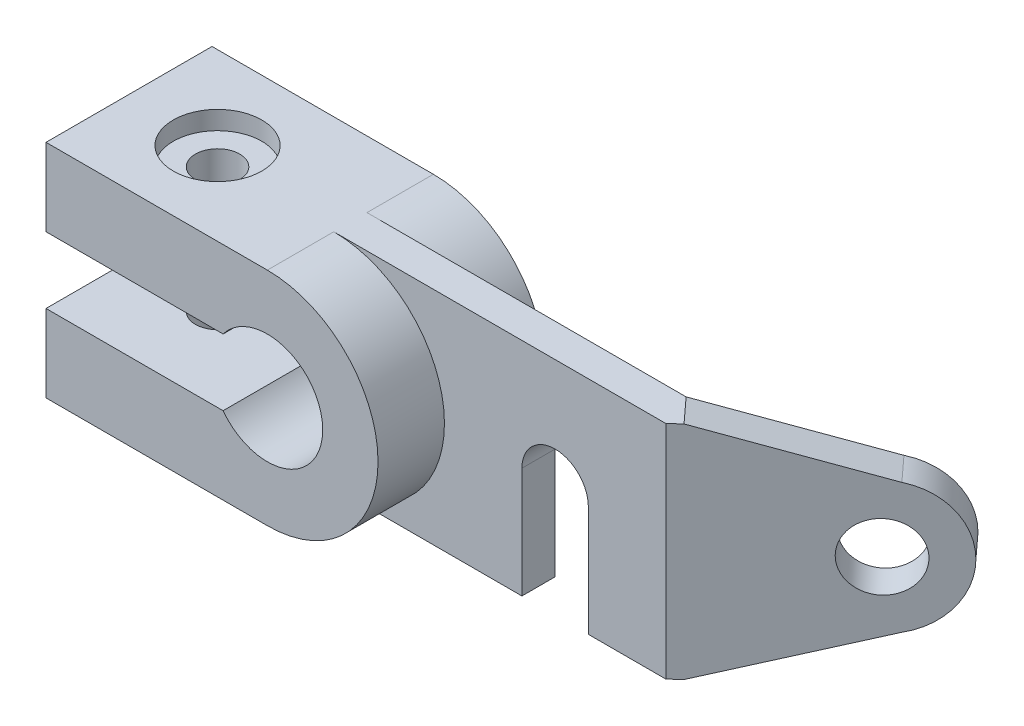
ISO-10303-21;
HEADER;
FILE_DESCRIPTION(('STEP AP214'),'2;1');
FILE_NAME('part.step','',(''),(''),'','','');
FILE_SCHEMA(('AUTOMOTIVE_DESIGN { 1 0 10303 214 1 1 1 1 }'));
ENDSEC;
DATA;
#1=APPLICATION_CONTEXT('core data for automotive mechanical design processes');
#2=APPLICATION_PROTOCOL_DEFINITION('international standard','automotive_design',2000,#1);
#3=PRODUCT_CONTEXT('',#1,'mechanical');
#4=PRODUCT('Part','Part','',(#3));
#5=PRODUCT_RELATED_PRODUCT_CATEGORY('part','',(#4));
#6=PRODUCT_DEFINITION_FORMATION('','',#4);
#7=PRODUCT_DEFINITION_CONTEXT('part definition',#1,'design');
#8=PRODUCT_DEFINITION('design','',#6,#7);
#9=PRODUCT_DEFINITION_SHAPE('','',#8);
#10=(LENGTH_UNIT() NAMED_UNIT(*) SI_UNIT(.MILLI.,.METRE.));
#11=(NAMED_UNIT(*) PLANE_ANGLE_UNIT() SI_UNIT($,.RADIAN.));
#12=(NAMED_UNIT(*) SI_UNIT($,.STERADIAN.) SOLID_ANGLE_UNIT());
#13=UNCERTAINTY_MEASURE_WITH_UNIT(LENGTH_MEASURE(1.E-05),#10,'distance_accuracy_value','');
#14=(GEOMETRIC_REPRESENTATION_CONTEXT(3) GLOBAL_UNCERTAINTY_ASSIGNED_CONTEXT((#13)) GLOBAL_UNIT_ASSIGNED_CONTEXT((#10,
#11,#12)) REPRESENTATION_CONTEXT('',''));
#15=CARTESIAN_POINT('',(0.,0.,0.));
#16=DIRECTION('',(0.,0.,1.));
#17=DIRECTION('',(1.,0.,0.));
#18=AXIS2_PLACEMENT_3D('',#15,#16,#17);
#19=CARTESIAN_POINT('',(0.,-30.,45.));
#20=DIRECTION('',(0.,1.,0.));
#21=DIRECTION('',(-1.,0.,0.));
#22=AXIS2_PLACEMENT_3D('',#19,#20,#21);
#23=PLANE('',#22);
#24=CARTESIAN_POINT('',(-36.,-30.,22.5));
#25=DIRECTION('',(0.,-1.,0.));
#26=DIRECTION('',(0.,0.,-1.));
#27=AXIS2_PLACEMENT_3D('',#24,#25,#26);
#28=CIRCLE('',#27,12.);
#29=CARTESIAN_POINT('',(-36.,-30.,10.5));
#30=VERTEX_POINT('',#29);
#31=EDGE_CURVE('E266',#30,#30,#28,.T.);
#32=ORIENTED_EDGE('',*,*,#31,.F.);
#33=EDGE_LOOP('',(#32));
#34=FACE_BOUND('',#33,.T.);
#35=DIRECTION('',(-1.,0.,0.));
#36=VECTOR('',#35,1.);
#37=CARTESIAN_POINT('',(90.,-30.,18.));
#38=LINE('',#37,#36);
#39=CARTESIAN_POINT('',(51.,-30.,18.));
#40=VERTEX_POINT('',#39);
#41=CARTESIAN_POINT('',(0.,-30.,18.));
#42=VERTEX_POINT('',#41);
#43=EDGE_CURVE('E244',#40,#42,#38,.T.);
#44=ORIENTED_EDGE('',*,*,#43,.F.);
#45=DIRECTION('',(0.,0.,-1.));
#46=VECTOR('',#45,1.);
#47=CARTESIAN_POINT('',(51.,-30.,86.));
#48=LINE('',#47,#46);
#49=CARTESIAN_POINT('',(51.,-30.,27.));
#50=VERTEX_POINT('',#49);
#51=EDGE_CURVE('E202',#50,#40,#48,.T.);
#52=ORIENTED_EDGE('',*,*,#51,.F.);
#53=DIRECTION('',(-1.,0.,0.));
#54=VECTOR('',#53,1.);
#55=CARTESIAN_POINT('',(90.,-30.,27.));
#56=LINE('',#55,#54);
#57=CARTESIAN_POINT('',(0.,-30.,27.));
#58=VERTEX_POINT('',#57);
#59=EDGE_CURVE('E257',#50,#58,#56,.T.);
#60=ORIENTED_EDGE('',*,*,#59,.T.);
#61=DIRECTION('',(0.,0.,-1.));
#62=VECTOR('',#61,1.);
#63=CARTESIAN_POINT('',(0.,-30.,45.));
#64=LINE('',#63,#62);
#65=CARTESIAN_POINT('',(0.,-30.,45.));
#66=VERTEX_POINT('',#65);
#67=EDGE_CURVE('E356',#66,#58,#64,.T.);
#68=ORIENTED_EDGE('',*,*,#67,.F.);
#69=DIRECTION('',(1.,0.,0.));
#70=VECTOR('',#69,1.);
#71=CARTESIAN_POINT('',(0.,-30.,45.));
#72=LINE('',#71,#70);
#73=CARTESIAN_POINT('',(-60.,-30.,45.));
#74=VERTEX_POINT('',#73);
#75=EDGE_CURVE('E322',#74,#66,#72,.T.);
#76=ORIENTED_EDGE('',*,*,#75,.F.);
#77=DIRECTION('',(0.,0.,-1.));
#78=VECTOR('',#77,1.);
#79=CARTESIAN_POINT('',(-60.,-30.,45.));
#80=LINE('',#79,#78);
#81=CARTESIAN_POINT('',(-60.,-30.,0.));
#82=VERTEX_POINT('',#81);
#83=EDGE_CURVE('E360',#74,#82,#80,.T.);
#84=ORIENTED_EDGE('',*,*,#83,.T.);
#85=DIRECTION('',(1.,0.,0.));
#86=VECTOR('',#85,1.);
#87=CARTESIAN_POINT('',(0.,-30.,0.));
#88=LINE('',#87,#86);
#89=CARTESIAN_POINT('',(0.,-30.,0.));
#90=VERTEX_POINT('',#89);
#91=EDGE_CURVE('E304',#82,#90,#88,.T.);
#92=ORIENTED_EDGE('',*,*,#91,.T.);
#93=EDGE_CURVE('E325',#42,#90,#64,.T.);
#94=ORIENTED_EDGE('',*,*,#93,.F.);
#95=EDGE_LOOP('',(#44,#52,#60,#68,#76,#84,#92,#94));
#96=FACE_BOUND('',#95,.T.);
#97=ADVANCED_FACE('F39',(#34,#96),#23,.F.);
#98=CARTESIAN_POINT('',(-36.,30.,22.5));
#99=DIRECTION('',(0.,1.,0.));
#100=DIRECTION('',(0.,0.,1.));
#101=AXIS2_PLACEMENT_3D('',#98,#99,#100);
#102=CYLINDRICAL_SURFACE('',#101,6.);
#103=CARTESIAN_POINT('',(-36.,-25.,22.5));
#104=DIRECTION('',(0.,-1.,0.));
#105=DIRECTION('',(0.,0.,-1.));
#106=AXIS2_PLACEMENT_3D('',#103,#104,#105);
#107=CIRCLE('',#106,6.);
#108=CARTESIAN_POINT('',(-36.,-25.,16.5));
#109=VERTEX_POINT('',#108);
#110=EDGE_CURVE('E272',#109,#109,#107,.T.);
#111=ORIENTED_EDGE('',*,*,#110,.T.);
#112=EDGE_LOOP('',(#111));
#113=FACE_BOUND('',#112,.T.);
#114=CARTESIAN_POINT('',(-36.,-9.00000000000001,22.5));
#115=DIRECTION('',(0.,-1.,0.));
#116=DIRECTION('',(1.,0.,0.));
#117=AXIS2_PLACEMENT_3D('',#114,#115,#116);
#118=CIRCLE('',#117,6.);
#119=CARTESIAN_POINT('',(-30.,-9.00000000000001,22.5));
#120=VERTEX_POINT('',#119);
#121=EDGE_CURVE('E267',#120,#120,#118,.F.);
#122=ORIENTED_EDGE('',*,*,#121,.T.);
#123=EDGE_LOOP('',(#122));
#124=FACE_BOUND('',#123,.T.);
#125=ADVANCED_FACE('F471',(#113,#124),#102,.F.);
#126=CARTESIAN_POINT('',(-60.,-30.,45.));
#127=DIRECTION('',(1.,0.,0.));
#128=DIRECTION('',(0.,0.,-1.));
#129=AXIS2_PLACEMENT_3D('',#126,#127,#128);
#130=PLANE('',#129);
#131=DIRECTION('',(0.,0.,-1.));
#132=VECTOR('',#131,1.);
#133=CARTESIAN_POINT('',(-60.,-9.00000000000001,45.));
#134=LINE('',#133,#132);
#135=CARTESIAN_POINT('',(-60.,-9.00000000000001,45.));
#136=VERTEX_POINT('',#135);
#137=CARTESIAN_POINT('',(-60.,-9.00000000000001,0.));
#138=VERTEX_POINT('',#137);
#139=EDGE_CURVE('E363',#136,#138,#134,.T.);
#140=ORIENTED_EDGE('',*,*,#139,.T.);
#141=DIRECTION('',(0.,-1.,0.));
#142=VECTOR('',#141,1.);
#143=CARTESIAN_POINT('',(-60.,-30.,0.));
#144=LINE('',#143,#142);
#145=EDGE_CURVE('E349',#138,#82,#144,.T.);
#146=ORIENTED_EDGE('',*,*,#145,.T.);
#147=ORIENTED_EDGE('',*,*,#83,.F.);
#148=DIRECTION('',(0.,-1.,0.));
#149=VECTOR('',#148,1.);
#150=CARTESIAN_POINT('',(-60.,-30.,45.));
#151=LINE('',#150,#149);
#152=EDGE_CURVE('E319',#136,#74,#151,.T.);
#153=ORIENTED_EDGE('',*,*,#152,.F.);
#154=EDGE_LOOP('',(#140,#146,#147,#153));
#155=FACE_BOUND('',#154,.T.);
#156=ADVANCED_FACE('F449',(#155),#130,.F.);
#157=CARTESIAN_POINT('',(-36.,25.,22.5));
#158=DIRECTION('',(0.,1.,0.));
#159=DIRECTION('',(0.,0.,1.));
#160=AXIS2_PLACEMENT_3D('',#157,#158,#159);
#161=CIRCLE('',#160,6.);
#162=CARTESIAN_POINT('',(-36.,25.,28.5));
#163=VERTEX_POINT('',#162);
#164=EDGE_CURVE('E290',#163,#163,#161,.T.);
#165=ORIENTED_EDGE('',*,*,#164,.T.);
#166=EDGE_LOOP('',(#165));
#167=FACE_BOUND('',#166,.T.);
#168=CARTESIAN_POINT('',(-36.,8.99999999999999,22.5));
#169=DIRECTION('',(0.,1.,0.));
#170=DIRECTION('',(0.,0.,1.));
#171=AXIS2_PLACEMENT_3D('',#168,#169,#170);
#172=CIRCLE('',#171,5.99999999999999);
#173=CARTESIAN_POINT('',(-36.,8.99999999999999,28.5));
#174=VERTEX_POINT('',#173);
#175=EDGE_CURVE('E294',#174,#174,#172,.T.);
#176=ORIENTED_EDGE('',*,*,#175,.F.);
#177=EDGE_LOOP('',(#176));
#178=FACE_BOUND('',#177,.T.);
#179=ADVANCED_FACE('F467',(#167,#178),#102,.F.);
#180=CARTESIAN_POINT('',(0.,0.,45.));
#181=DIRECTION('',(0.,0.,-1.));
#182=DIRECTION('',(-1.,0.,0.));
#183=AXIS2_PLACEMENT_3D('',#180,#181,#182);
#184=CYLINDRICAL_SURFACE('',#183,30.);
#185=DIRECTION('',(0.,0.,-1.));
#186=VECTOR('',#185,1.);
#187=CARTESIAN_POINT('',(0.,30.,45.));
#188=LINE('',#187,#186);
#189=CARTESIAN_POINT('',(0.,30.,18.));
#190=VERTEX_POINT('',#189);
#191=CARTESIAN_POINT('',(0.,30.,0.));
#192=VERTEX_POINT('',#191);
#193=EDGE_CURVE('E378',#190,#192,#188,.T.);
#194=ORIENTED_EDGE('',*,*,#193,.F.);
#195=CARTESIAN_POINT('',(0.,0.,18.));
#196=DIRECTION('',(0.,0.,-1.));
#197=DIRECTION('',(0.,1.,0.));
#198=AXIS2_PLACEMENT_3D('',#195,#196,#197);
#199=CIRCLE('',#198,30.);
#200=EDGE_CURVE('E262',#190,#42,#199,.T.);
#201=ORIENTED_EDGE('',*,*,#200,.T.);
#202=ORIENTED_EDGE('',*,*,#93,.T.);
#203=CARTESIAN_POINT('',(0.,0.,0.));
#204=DIRECTION('',(0.,0.,1.));
#205=DIRECTION('',(1.,0.,0.));
#206=AXIS2_PLACEMENT_3D('',#203,#204,#205);
#207=CIRCLE('',#206,30.);
#208=EDGE_CURVE('E298',#90,#192,#207,.T.);
#209=ORIENTED_EDGE('',*,*,#208,.T.);
#210=EDGE_LOOP('',(#194,#201,#202,#209));
#211=FACE_BOUND('',#210,.T.);
#212=ADVANCED_FACE('F422',(#211),#184,.T.);
#213=CARTESIAN_POINT('',(-60.,-9.00000000000001,45.));
#214=DIRECTION('',(0.,-1.,0.));
#215=DIRECTION('',(1.,0.,0.));
#216=AXIS2_PLACEMENT_3D('',#213,#214,#215);
#217=PLANE('',#216);
#218=ORIENTED_EDGE('',*,*,#121,.F.);
#219=EDGE_LOOP('',(#218));
#220=FACE_BOUND('',#219,.T.);
#221=DIRECTION('',(0.,0.,-1.));
#222=VECTOR('',#221,1.);
#223=CARTESIAN_POINT('',(-12.,-9.,45.));
#224=LINE('',#223,#222);
#225=CARTESIAN_POINT('',(-12.,-9.,45.));
#226=VERTEX_POINT('',#225);
#227=CARTESIAN_POINT('',(-12.,-9.,0.));
#228=VERTEX_POINT('',#227);
#229=EDGE_CURVE('E366',#226,#228,#224,.T.);
#230=ORIENTED_EDGE('',*,*,#229,.T.);
#231=DIRECTION('',(-1.,0.,0.));
#232=VECTOR('',#231,1.);
#233=CARTESIAN_POINT('',(-60.,-9.00000000000001,0.));
#234=LINE('',#233,#232);
#235=EDGE_CURVE('E345',#228,#138,#234,.T.);
#236=ORIENTED_EDGE('',*,*,#235,.T.);
#237=ORIENTED_EDGE('',*,*,#139,.F.);
#238=DIRECTION('',(-1.,0.,0.));
#239=VECTOR('',#238,1.);
#240=CARTESIAN_POINT('',(-60.,-9.00000000000001,45.));
#241=LINE('',#240,#239);
#242=EDGE_CURVE('E316',#226,#136,#241,.T.);
#243=ORIENTED_EDGE('',*,*,#242,.F.);
#244=EDGE_LOOP('',(#230,#236,#237,#243));
#245=FACE_BOUND('',#244,.T.);
#246=ADVANCED_FACE('F453',(#220,#245),#217,.F.);
#247=ORIENTED_EDGE('',*,*,#67,.T.);
#248=CARTESIAN_POINT('',(0.,0.,27.));
#249=DIRECTION('',(0.,0.,1.));
#250=DIRECTION('',(0.,-1.,0.));
#251=AXIS2_PLACEMENT_3D('',#248,#249,#250);
#252=CIRCLE('',#251,30.);
#253=CARTESIAN_POINT('',(0.,30.,27.));
#254=VERTEX_POINT('',#253);
#255=EDGE_CURVE('E248',#58,#254,#252,.T.);
#256=ORIENTED_EDGE('',*,*,#255,.T.);
#257=CARTESIAN_POINT('',(0.,30.,45.));
#258=VERTEX_POINT('',#257);
#259=EDGE_CURVE('E379',#258,#254,#188,.T.);
#260=ORIENTED_EDGE('',*,*,#259,.F.);
#261=CARTESIAN_POINT('',(0.,0.,45.));
#262=DIRECTION('',(0.,0.,1.));
#263=DIRECTION('',(1.,0.,0.));
#264=AXIS2_PLACEMENT_3D('',#261,#262,#263);
#265=CIRCLE('',#264,30.);
#266=EDGE_CURVE('E299',#66,#258,#265,.T.);
#267=ORIENTED_EDGE('',*,*,#266,.F.);
#268=EDGE_LOOP('',(#247,#256,#260,#267));
#269=FACE_BOUND('',#268,.T.);
#270=ADVANCED_FACE('F41',(#269),#184,.T.);
#271=CARTESIAN_POINT('',(0.,30.,45.));
#272=DIRECTION('',(0.,-1.,0.));
#273=DIRECTION('',(1.,0.,0.));
#274=AXIS2_PLACEMENT_3D('',#271,#272,#273);
#275=PLANE('',#274);
#276=CARTESIAN_POINT('',(-36.,30.,22.5));
#277=DIRECTION('',(0.,1.,0.));
#278=DIRECTION('',(0.,0.,1.));
#279=AXIS2_PLACEMENT_3D('',#276,#277,#278);
#280=CIRCLE('',#279,12.);
#281=CARTESIAN_POINT('',(-36.,30.,34.5));
#282=VERTEX_POINT('',#281);
#283=EDGE_CURVE('E271',#282,#282,#280,.T.);
#284=ORIENTED_EDGE('',*,*,#283,.F.);
#285=EDGE_LOOP('',(#284));
#286=FACE_BOUND('',#285,.T.);
#287=DIRECTION('',(0.737801146634762,0.,-0.675018124219217));
#288=VECTOR('',#287,1.);
#289=CARTESIAN_POINT('',(90.,30.,27.));
#290=LINE('',#289,#288);
#291=CARTESIAN_POINT('',(90.,30.,27.));
#292=VERTEX_POINT('',#291);
#293=CARTESIAN_POINT('',(92.5792722735358,30.,24.6402103197128));
#294=VERTEX_POINT('',#293);
#295=EDGE_CURVE('E226',#292,#294,#290,.T.);
#296=ORIENTED_EDGE('',*,*,#295,.T.);
#297=DIRECTION('',(-0.67501812421922,0.,-0.73780114663476));
#298=VECTOR('',#297,1.);
#299=CARTESIAN_POINT('',(132.40534160247,30.,68.1704779711637));
#300=LINE('',#299,#298);
#301=CARTESIAN_POINT('',(86.5041091555628,30.,18.));
#302=VERTEX_POINT('',#301);
#303=EDGE_CURVE('E222',#294,#302,#300,.T.);
#304=ORIENTED_EDGE('',*,*,#303,.T.);
#305=DIRECTION('',(-1.,0.,0.));
#306=VECTOR('',#305,1.);
#307=CARTESIAN_POINT('',(90.,30.,18.));
#308=LINE('',#307,#306);
#309=EDGE_CURVE('E245',#302,#190,#308,.T.);
#310=ORIENTED_EDGE('',*,*,#309,.T.);
#311=ORIENTED_EDGE('',*,*,#193,.T.);
#312=DIRECTION('',(-1.,0.,0.));
#313=VECTOR('',#312,1.);
#314=CARTESIAN_POINT('',(0.,30.,0.));
#315=LINE('',#314,#313);
#316=CARTESIAN_POINT('',(-60.,30.,0.));
#317=VERTEX_POINT('',#316);
#318=EDGE_CURVE('E329',#192,#317,#315,.T.);
#319=ORIENTED_EDGE('',*,*,#318,.T.);
#320=DIRECTION('',(0.,0.,-1.));
#321=VECTOR('',#320,1.);
#322=CARTESIAN_POINT('',(-60.,30.,45.));
#323=LINE('',#322,#321);
#324=CARTESIAN_POINT('',(-60.,30.,45.));
#325=VERTEX_POINT('',#324);
#326=EDGE_CURVE('E375',#325,#317,#323,.T.);
#327=ORIENTED_EDGE('',*,*,#326,.F.);
#328=DIRECTION('',(-1.,0.,0.));
#329=VECTOR('',#328,1.);
#330=CARTESIAN_POINT('',(0.,30.,45.));
#331=LINE('',#330,#329);
#332=EDGE_CURVE('E303',#258,#325,#331,.T.);
#333=ORIENTED_EDGE('',*,*,#332,.F.);
#334=ORIENTED_EDGE('',*,*,#259,.T.);
#335=DIRECTION('',(-1.,0.,0.));
#336=VECTOR('',#335,1.);
#337=CARTESIAN_POINT('',(90.,30.,27.));
#338=LINE('',#337,#336);
#339=EDGE_CURVE('E249',#292,#254,#338,.T.);
#340=ORIENTED_EDGE('',*,*,#339,.F.);
#341=EDGE_LOOP('',(#296,#304,#310,#311,#319,#327,#333,#334,#340));
#342=FACE_BOUND('',#341,.T.);
#343=ADVANCED_FACE('F426',(#286,#342),#275,.F.);
#344=CARTESIAN_POINT('',(-60.,8.99999999999999,45.));
#345=DIRECTION('',(0.,1.,0.));
#346=DIRECTION('',(-1.,0.,0.));
#347=AXIS2_PLACEMENT_3D('',#344,#345,#346);
#348=PLANE('',#347);
#349=DIRECTION('',(0.,0.,-1.));
#350=VECTOR('',#349,1.);
#351=CARTESIAN_POINT('',(-60.,8.99999999999999,45.));
#352=LINE('',#351,#350);
#353=CARTESIAN_POINT('',(-60.,8.99999999999999,45.));
#354=VERTEX_POINT('',#353);
#355=CARTESIAN_POINT('',(-60.,8.99999999999999,0.));
#356=VERTEX_POINT('',#355);
#357=EDGE_CURVE('E372',#354,#356,#352,.T.);
#358=ORIENTED_EDGE('',*,*,#357,.T.);
#359=DIRECTION('',(1.,0.,0.));
#360=VECTOR('',#359,1.);
#361=CARTESIAN_POINT('',(-60.,8.99999999999999,0.));
#362=LINE('',#361,#360);
#363=CARTESIAN_POINT('',(-12.,8.99999999999999,0.));
#364=VERTEX_POINT('',#363);
#365=EDGE_CURVE('E337',#356,#364,#362,.T.);
#366=ORIENTED_EDGE('',*,*,#365,.T.);
#367=DIRECTION('',(0.,0.,-1.));
#368=VECTOR('',#367,1.);
#369=CARTESIAN_POINT('',(-12.,8.99999999999999,45.));
#370=LINE('',#369,#368);
#371=CARTESIAN_POINT('',(-12.,8.99999999999999,45.));
#372=VERTEX_POINT('',#371);
#373=EDGE_CURVE('E369',#372,#364,#370,.T.);
#374=ORIENTED_EDGE('',*,*,#373,.F.);
#375=DIRECTION('',(1.,0.,0.));
#376=VECTOR('',#375,1.);
#377=CARTESIAN_POINT('',(-60.,8.99999999999999,45.));
#378=LINE('',#377,#376);
#379=EDGE_CURVE('E310',#354,#372,#378,.T.);
#380=ORIENTED_EDGE('',*,*,#379,.F.);
#381=EDGE_LOOP('',(#358,#366,#374,#380));
#382=FACE_BOUND('',#381,.T.);
#383=ORIENTED_EDGE('',*,*,#175,.T.);
#384=EDGE_LOOP('',(#383));
#385=FACE_BOUND('',#384,.T.);
#386=ADVANCED_FACE('F461',(#382,#385),#348,.F.);
#387=CARTESIAN_POINT('',(0.,0.,45.));
#388=DIRECTION('',(0.,0.,-1.));
#389=DIRECTION('',(-1.,0.,0.));
#390=AXIS2_PLACEMENT_3D('',#387,#388,#389);
#391=CYLINDRICAL_SURFACE('',#390,15.);
#392=ORIENTED_EDGE('',*,*,#373,.T.);
#393=CARTESIAN_POINT('',(0.,0.,0.));
#394=DIRECTION('',(0.,0.,-1.));
#395=DIRECTION('',(1.,0.,0.));
#396=AXIS2_PLACEMENT_3D('',#393,#394,#395);
#397=CIRCLE('',#396,15.);
#398=EDGE_CURVE('E341',#364,#228,#397,.T.);
#399=ORIENTED_EDGE('',*,*,#398,.T.);
#400=ORIENTED_EDGE('',*,*,#229,.F.);
#401=CARTESIAN_POINT('',(0.,0.,45.));
#402=DIRECTION('',(0.,0.,-1.));
#403=DIRECTION('',(1.,0.,0.));
#404=AXIS2_PLACEMENT_3D('',#401,#402,#403);
#405=CIRCLE('',#404,15.);
#406=EDGE_CURVE('E313',#372,#226,#405,.T.);
#407=ORIENTED_EDGE('',*,*,#406,.F.);
#408=EDGE_LOOP('',(#392,#399,#400,#407));
#409=FACE_BOUND('',#408,.T.);
#410=ADVANCED_FACE('F458',(#409),#391,.F.);
#411=DIRECTION('',(0.,-1.,0.));
#412=VECTOR('',#411,1.);
#413=CARTESIAN_POINT('',(-60.,8.99999999999999,0.));
#414=LINE('',#413,#412);
#415=EDGE_CURVE('E333',#317,#356,#414,.T.);
#416=ORIENTED_EDGE('',*,*,#415,.T.);
#417=ORIENTED_EDGE('',*,*,#357,.F.);
#418=DIRECTION('',(0.,-1.,0.));
#419=VECTOR('',#418,1.);
#420=CARTESIAN_POINT('',(-60.,8.99999999999999,45.));
#421=LINE('',#420,#419);
#422=EDGE_CURVE('E307',#325,#354,#421,.T.);
#423=ORIENTED_EDGE('',*,*,#422,.F.);
#424=ORIENTED_EDGE('',*,*,#326,.T.);
#425=EDGE_LOOP('',(#416,#417,#423,#424));
#426=FACE_BOUND('',#425,.T.);
#427=ADVANCED_FACE('F435',(#426),#130,.F.);
#428=CARTESIAN_POINT('',(90.,-30.,27.));
#429=VERTEX_POINT('',#428);
#430=CARTESIAN_POINT('',(69.,-30.,27.));
#431=VERTEX_POINT('',#430);
#432=EDGE_CURVE('E253',#429,#431,#56,.T.);
#433=ORIENTED_EDGE('',*,*,#432,.T.);
#434=DIRECTION('',(0.,0.,-1.));
#435=VECTOR('',#434,1.);
#436=CARTESIAN_POINT('',(69.,-30.,86.));
#437=LINE('',#436,#435);
#438=CARTESIAN_POINT('',(69.,-30.,18.));
#439=VERTEX_POINT('',#438);
#440=EDGE_CURVE('E55',#431,#439,#437,.T.);
#441=ORIENTED_EDGE('',*,*,#440,.T.);
#442=CARTESIAN_POINT('',(86.5041091555628,-30.,18.));
#443=VERTEX_POINT('',#442);
#444=EDGE_CURVE('E193',#443,#439,#38,.T.);
#445=ORIENTED_EDGE('',*,*,#444,.F.);
#446=DIRECTION('',(-0.67501812421922,0.,-0.73780114663476));
#447=VECTOR('',#446,1.);
#448=CARTESIAN_POINT('',(132.40534160247,-30.,68.1704779711637));
#449=LINE('',#448,#447);
#450=CARTESIAN_POINT('',(92.5792722735358,-30.,24.6402103197128));
#451=VERTEX_POINT('',#450);
#452=EDGE_CURVE('E221',#451,#443,#449,.T.);
#453=ORIENTED_EDGE('',*,*,#452,.F.);
#454=DIRECTION('',(-0.737801146634762,0.,0.675018124219217));
#455=VECTOR('',#454,1.);
#456=CARTESIAN_POINT('',(90.,-30.,27.));
#457=LINE('',#456,#455);
#458=EDGE_CURVE('E237',#451,#429,#457,.T.);
#459=ORIENTED_EDGE('',*,*,#458,.T.);
#460=EDGE_LOOP('',(#433,#441,#445,#453,#459));
#461=FACE_BOUND('',#460,.T.);
#462=ADVANCED_FACE('F484',(#461),#23,.F.);
#463=CARTESIAN_POINT('',(0.,0.,45.));
#464=DIRECTION('',(0.,0.,1.));
#465=DIRECTION('',(1.,0.,0.));
#466=AXIS2_PLACEMENT_3D('',#463,#464,#465);
#467=PLANE('',#466);
#468=ORIENTED_EDGE('',*,*,#266,.T.);
#469=ORIENTED_EDGE('',*,*,#332,.T.);
#470=ORIENTED_EDGE('',*,*,#422,.T.);
#471=ORIENTED_EDGE('',*,*,#379,.T.);
#472=ORIENTED_EDGE('',*,*,#406,.T.);
#473=ORIENTED_EDGE('',*,*,#242,.T.);
#474=ORIENTED_EDGE('',*,*,#152,.T.);
#475=ORIENTED_EDGE('',*,*,#75,.T.);
#476=EDGE_LOOP('',(#468,#469,#470,#471,#472,#473,#474,#475));
#477=FACE_BOUND('',#476,.T.);
#478=ADVANCED_FACE('F442',(#477),#467,.T.);
#479=CARTESIAN_POINT('',(0.,0.,0.));
#480=DIRECTION('',(0.,0.,1.));
#481=DIRECTION('',(1.,0.,0.));
#482=AXIS2_PLACEMENT_3D('',#479,#480,#481);
#483=PLANE('',#482);
#484=ORIENTED_EDGE('',*,*,#208,.F.);
#485=ORIENTED_EDGE('',*,*,#91,.F.);
#486=ORIENTED_EDGE('',*,*,#145,.F.);
#487=ORIENTED_EDGE('',*,*,#235,.F.);
#488=ORIENTED_EDGE('',*,*,#398,.F.);
#489=ORIENTED_EDGE('',*,*,#365,.F.);
#490=ORIENTED_EDGE('',*,*,#415,.F.);
#491=ORIENTED_EDGE('',*,*,#318,.F.);
#492=EDGE_LOOP('',(#484,#485,#486,#487,#488,#489,#490,#491));
#493=FACE_BOUND('',#492,.T.);
#494=ADVANCED_FACE('F430',(#493),#483,.F.);
#495=CARTESIAN_POINT('',(-30.,25.,22.5));
#496=DIRECTION('',(0.,-1.,0.));
#497=DIRECTION('',(0.,0.,-1.));
#498=AXIS2_PLACEMENT_3D('',#495,#496,#497);
#499=PLANE('',#498);
#500=ORIENTED_EDGE('',*,*,#164,.F.);
#501=EDGE_LOOP('',(#500));
#502=FACE_BOUND('',#501,.T.);
#503=CARTESIAN_POINT('',(-36.,25.,22.5));
#504=DIRECTION('',(0.,1.,0.));
#505=DIRECTION('',(0.,0.,1.));
#506=AXIS2_PLACEMENT_3D('',#503,#504,#505);
#507=CIRCLE('',#506,12.);
#508=CARTESIAN_POINT('',(-36.,25.,34.5));
#509=VERTEX_POINT('',#508);
#510=EDGE_CURVE('E286',#509,#509,#507,.T.);
#511=ORIENTED_EDGE('',*,*,#510,.T.);
#512=EDGE_LOOP('',(#511));
#513=FACE_BOUND('',#512,.T.);
#514=ADVANCED_FACE('F547',(#502,#513),#499,.F.);
#515=CARTESIAN_POINT('',(-36.,30.,22.5));
#516=DIRECTION('',(0.,1.,0.));
#517=DIRECTION('',(0.,0.,1.));
#518=AXIS2_PLACEMENT_3D('',#515,#516,#517);
#519=CYLINDRICAL_SURFACE('',#518,12.);
#520=ORIENTED_EDGE('',*,*,#510,.F.);
#521=EDGE_LOOP('',(#520));
#522=FACE_BOUND('',#521,.T.);
#523=ORIENTED_EDGE('',*,*,#283,.T.);
#524=EDGE_LOOP('',(#523));
#525=FACE_BOUND('',#524,.T.);
#526=ADVANCED_FACE('F544',(#522,#525),#519,.F.);
#527=CARTESIAN_POINT('',(-30.,-25.,22.5));
#528=DIRECTION('',(0.,1.,0.));
#529=DIRECTION('',(0.,0.,1.));
#530=AXIS2_PLACEMENT_3D('',#527,#528,#529);
#531=PLANE('',#530);
#532=CARTESIAN_POINT('',(-36.,-25.,22.5));
#533=DIRECTION('',(0.,-1.,0.));
#534=DIRECTION('',(0.,0.,-1.));
#535=AXIS2_PLACEMENT_3D('',#532,#533,#534);
#536=CIRCLE('',#535,12.);
#537=CARTESIAN_POINT('',(-36.,-25.,10.5));
#538=VERTEX_POINT('',#537);
#539=EDGE_CURVE('E276',#538,#538,#536,.T.);
#540=ORIENTED_EDGE('',*,*,#539,.T.);
#541=EDGE_LOOP('',(#540));
#542=FACE_BOUND('',#541,.T.);
#543=ORIENTED_EDGE('',*,*,#110,.F.);
#544=EDGE_LOOP('',(#543));
#545=FACE_BOUND('',#544,.T.);
#546=ADVANCED_FACE('F540',(#542,#545),#531,.F.);
#547=CARTESIAN_POINT('',(-36.,-30.,22.5));
#548=DIRECTION('',(0.,-1.,0.));
#549=DIRECTION('',(0.,0.,-1.));
#550=AXIS2_PLACEMENT_3D('',#547,#548,#549);
#551=CYLINDRICAL_SURFACE('',#550,12.);
#552=ORIENTED_EDGE('',*,*,#31,.T.);
#553=EDGE_LOOP('',(#552));
#554=FACE_BOUND('',#553,.T.);
#555=ORIENTED_EDGE('',*,*,#539,.F.);
#556=EDGE_LOOP('',(#555));
#557=FACE_BOUND('',#556,.T.);
#558=ADVANCED_FACE('F537',(#554,#557),#551,.F.);
#559=CARTESIAN_POINT('',(90.,30.,18.));
#560=DIRECTION('',(0.,0.,-1.));
#561=DIRECTION('',(0.,1.,0.));
#562=AXIS2_PLACEMENT_3D('',#559,#560,#561);
#563=PLANE('',#562);
#564=DIRECTION('',(0.,1.,0.));
#565=VECTOR('',#564,1.);
#566=CARTESIAN_POINT('',(51.,0.,18.));
#567=LINE('',#566,#565);
#568=CARTESIAN_POINT('',(51.,0.,18.));
#569=VERTEX_POINT('',#568);
#570=EDGE_CURVE('E177',#40,#569,#567,.T.);
#571=ORIENTED_EDGE('',*,*,#570,.F.);
#572=ORIENTED_EDGE('',*,*,#43,.T.);
#573=ORIENTED_EDGE('',*,*,#200,.F.);
#574=ORIENTED_EDGE('',*,*,#309,.F.);
#575=DIRECTION('',(0.,1.,0.));
#576=VECTOR('',#575,1.);
#577=CARTESIAN_POINT('',(86.5041091555628,30.,18.));
#578=LINE('',#577,#576);
#579=EDGE_CURVE('E383',#443,#302,#578,.T.);
#580=ORIENTED_EDGE('',*,*,#579,.F.);
#581=ORIENTED_EDGE('',*,*,#444,.T.);
#582=DIRECTION('',(0.,-1.,0.));
#583=VECTOR('',#582,1.);
#584=CARTESIAN_POINT('',(69.,0.,18.));
#585=LINE('',#584,#583);
#586=CARTESIAN_POINT('',(69.,0.,18.));
#587=VERTEX_POINT('',#586);
#588=EDGE_CURVE('E172',#587,#439,#585,.T.);
#589=ORIENTED_EDGE('',*,*,#588,.F.);
#590=CARTESIAN_POINT('',(60.,0.,18.));
#591=DIRECTION('',(0.,0.,-1.));
#592=DIRECTION('',(0.,1.,0.));
#593=AXIS2_PLACEMENT_3D('',#590,#591,#592);
#594=CIRCLE('',#593,9.00000000000001);
#595=EDGE_CURVE('E180',#569,#587,#594,.T.);
#596=ORIENTED_EDGE('',*,*,#595,.F.);
#597=EDGE_LOOP('',(#571,#572,#573,#574,#580,#581,#589,#596));
#598=FACE_BOUND('',#597,.T.);
#599=ADVANCED_FACE('F190',(#598),#563,.T.);
#600=CARTESIAN_POINT('',(90.,30.,27.));
#601=DIRECTION('',(0.,0.,1.));
#602=DIRECTION('',(0.,-1.,0.));
#603=AXIS2_PLACEMENT_3D('',#600,#601,#602);
#604=PLANE('',#603);
#605=DIRECTION('',(0.,-1.,0.));
#606=VECTOR('',#605,1.);
#607=CARTESIAN_POINT('',(51.,30.,27.));
#608=LINE('',#607,#606);
#609=CARTESIAN_POINT('',(51.,0.,27.));
#610=VERTEX_POINT('',#609);
#611=EDGE_CURVE('E11',#610,#50,#608,.T.);
#612=ORIENTED_EDGE('',*,*,#611,.F.);
#613=CARTESIAN_POINT('',(60.,0.,27.));
#614=DIRECTION('',(0.,0.,1.));
#615=DIRECTION('',(0.,-1.,0.));
#616=AXIS2_PLACEMENT_3D('',#613,#614,#615);
#617=CIRCLE('',#616,9.00000000000001);
#618=CARTESIAN_POINT('',(69.,0.,27.));
#619=VERTEX_POINT('',#618);
#620=EDGE_CURVE('E48',#619,#610,#617,.T.);
#621=ORIENTED_EDGE('',*,*,#620,.F.);
#622=DIRECTION('',(0.,1.,0.));
#623=VECTOR('',#622,1.);
#624=CARTESIAN_POINT('',(69.,30.,27.));
#625=LINE('',#624,#623);
#626=EDGE_CURVE('E173',#431,#619,#625,.T.);
#627=ORIENTED_EDGE('',*,*,#626,.F.);
#628=ORIENTED_EDGE('',*,*,#432,.F.);
#629=DIRECTION('',(0.,1.,0.));
#630=VECTOR('',#629,1.);
#631=CARTESIAN_POINT('',(90.,30.,27.));
#632=LINE('',#631,#630);
#633=EDGE_CURVE('E240',#429,#292,#632,.T.);
#634=ORIENTED_EDGE('',*,*,#633,.T.);
#635=ORIENTED_EDGE('',*,*,#339,.T.);
#636=ORIENTED_EDGE('',*,*,#255,.F.);
#637=ORIENTED_EDGE('',*,*,#59,.F.);
#638=EDGE_LOOP('',(#612,#621,#627,#628,#634,#635,#636,#637));
#639=FACE_BOUND('',#638,.T.);
#640=ADVANCED_FACE('F407',(#639),#604,.T.);
#641=CARTESIAN_POINT('',(83.9248368820271,-99.4691116978831,20.3597896802871));
#642=DIRECTION('',(-0.67501812421922,0.,-0.73780114663476));
#643=DIRECTION('',(-0.73780114663476,0.,0.67501812421922));
#644=AXIS2_PLACEMENT_3D('',#641,#642,#643);
#645=PLANE('',#644);
#646=CARTESIAN_POINT('',(114.540552727684,0.,-7.65068872033035));
#647=DIRECTION('',(-0.67501812421922,0.,-0.73780114663476));
#648=DIRECTION('',(-0.73780114663476,0.,0.67501812421922));
#649=AXIS2_PLACEMENT_3D('',#646,#647,#648);
#650=CIRCLE('',#649,8.99999999999999);
#651=CARTESIAN_POINT('',(107.900342407971,0.,-1.57552560235737));
#652=VERTEX_POINT('',#651);
#653=EDGE_CURVE('E201',#652,#652,#650,.T.);
#654=ORIENTED_EDGE('',*,*,#653,.F.);
#655=EDGE_LOOP('',(#654));
#656=FACE_BOUND('',#655,.T.);
#657=DIRECTION('',(-0.707306646784677,0.284525734488815,0.647118546966332));
#658=VECTOR('',#657,1.);
#659=CARTESIAN_POINT('',(86.5041091555628,30.,18.));
#660=LINE('',#659,#658);
#661=CARTESIAN_POINT('',(117.341917443499,17.5949843069673,-10.2136719365378));
#662=VERTEX_POINT('',#661);
#663=EDGE_CURVE('E218',#662,#302,#660,.T.);
#664=ORIENTED_EDGE('',*,*,#663,.F.);
#665=CARTESIAN_POINT('',(114.540552727684,0.,-7.65068872033033));
#666=DIRECTION('',(0.67501812421922,0.,0.73780114663476));
#667=DIRECTION('',(-0.73780114663476,0.,0.67501812421922));
#668=AXIS2_PLACEMENT_3D('',#665,#666,#667);
#669=CIRCLE('',#668,18.);
#670=CARTESIAN_POINT('',(117.341917443499,-17.5949843069673,-10.2136719365378));
#671=VERTEX_POINT('',#670);
#672=EDGE_CURVE('E214',#671,#662,#669,.T.);
#673=ORIENTED_EDGE('',*,*,#672,.F.);
#674=DIRECTION('',(0.707306646784677,0.284525734488815,-0.647118546966332));
#675=VECTOR('',#674,1.);
#676=CARTESIAN_POINT('',(86.5041091555628,-30.,18.));
#677=LINE('',#676,#675);
#678=EDGE_CURVE('E211',#443,#671,#677,.T.);
#679=ORIENTED_EDGE('',*,*,#678,.F.);
#680=ORIENTED_EDGE('',*,*,#579,.T.);
#681=EDGE_LOOP('',(#664,#673,#679,#680));
#682=FACE_BOUND('',#681,.T.);
#683=ADVANCED_FACE('F508',(#656,#682),#645,.T.);
#684=CARTESIAN_POINT('',(90.,-99.4691116978831,27.));
#685=DIRECTION('',(0.675018124219217,0.,0.737801146634762));
#686=DIRECTION('',(0.737801146634762,0.,-0.675018124219217));
#687=AXIS2_PLACEMENT_3D('',#684,#685,#686);
#688=PLANE('',#687);
#689=CARTESIAN_POINT('',(120.615715845657,0.,-1.01047840061742));
#690=DIRECTION('',(0.675018124219217,0.,0.737801146634762));
#691=DIRECTION('',(0.737801146634762,0.,-0.675018124219217));
#692=AXIS2_PLACEMENT_3D('',#689,#690,#691);
#693=CIRCLE('',#692,8.99999999999999);
#694=CARTESIAN_POINT('',(127.25592616537,0.,-7.08564151859037));
#695=VERTEX_POINT('',#694);
#696=EDGE_CURVE('E210',#695,#695,#693,.T.);
#697=ORIENTED_EDGE('',*,*,#696,.F.);
#698=EDGE_LOOP('',(#697));
#699=FACE_BOUND('',#698,.T.);
#700=DIRECTION('',(0.70730664678468,-0.284525734488815,-0.647118546966329));
#701=VECTOR('',#700,1.);
#702=CARTESIAN_POINT('',(116.264067678541,20.4724014125123,2.97086724573568));
#703=LINE('',#702,#701);
#704=CARTESIAN_POINT('',(123.417080561472,17.5949843069673,-3.57346161682482));
#705=VERTEX_POINT('',#704);
#706=EDGE_CURVE('E393',#294,#705,#703,.T.);
#707=ORIENTED_EDGE('',*,*,#706,.F.);
#708=ORIENTED_EDGE('',*,*,#295,.F.);
#709=ORIENTED_EDGE('',*,*,#633,.F.);
#710=ORIENTED_EDGE('',*,*,#458,.F.);
#711=DIRECTION('',(-0.70730664678468,-0.284525734488815,0.647118546966329));
#712=VECTOR('',#711,1.);
#713=CARTESIAN_POINT('',(76.2283583374421,-36.577424117784,39.5997469167407));
#714=LINE('',#713,#712);
#715=CARTESIAN_POINT('',(123.417080561472,-17.5949843069673,-3.57346161682483));
#716=VERTEX_POINT('',#715);
#717=EDGE_CURVE('E387',#716,#451,#714,.T.);
#718=ORIENTED_EDGE('',*,*,#717,.F.);
#719=CARTESIAN_POINT('',(120.615715845657,0.,-1.0104784006174));
#720=DIRECTION('',(0.675018124219217,0.,0.737801146634762));
#721=DIRECTION('',(0.737801146634762,0.,-0.675018124219217));
#722=AXIS2_PLACEMENT_3D('',#719,#720,#721);
#723=CIRCLE('',#722,18.);
#724=EDGE_CURVE('E390',#705,#716,#723,.F.);
#725=ORIENTED_EDGE('',*,*,#724,.F.);
#726=EDGE_LOOP('',(#707,#708,#709,#710,#718,#725));
#727=FACE_BOUND('',#726,.T.);
#728=ADVANCED_FACE('F501',(#699,#727),#688,.T.);
#729=CARTESIAN_POINT('',(132.40534160247,30.,68.1704779711637));
#730=DIRECTION('',(-0.209923413152945,-0.958668402740802,0.192060027586736));
#731=DIRECTION('',(0.976854323947292,-0.213905656272758,0.));
#732=AXIS2_PLACEMENT_3D('',#729,#730,#731);
#733=PLANE('',#732);
#734=ORIENTED_EDGE('',*,*,#706,.T.);
#735=DIRECTION('',(-0.67501812421922,0.,-0.73780114663476));
#736=VECTOR('',#735,1.);
#737=CARTESIAN_POINT('',(163.243149890406,17.5949843069673,39.9568060346259));
#738=LINE('',#737,#736);
#739=EDGE_CURVE('E227',#705,#662,#738,.T.);
#740=ORIENTED_EDGE('',*,*,#739,.T.);
#741=ORIENTED_EDGE('',*,*,#663,.T.);
#742=ORIENTED_EDGE('',*,*,#303,.F.);
#743=EDGE_LOOP('',(#734,#740,#741,#742));
#744=FACE_BOUND('',#743,.T.);
#745=ADVANCED_FACE('F514',(#744),#733,.F.);
#746=CARTESIAN_POINT('',(160.441785174591,0.,42.5197892508333));
#747=DIRECTION('',(-0.67501812421922,0.,-0.73780114663476));
#748=DIRECTION('',(-0.73780114663476,0.,0.67501812421922));
#749=AXIS2_PLACEMENT_3D('',#746,#747,#748);
#750=CYLINDRICAL_SURFACE('',#749,18.);
#751=ORIENTED_EDGE('',*,*,#724,.T.);
#752=DIRECTION('',(-0.67501812421922,0.,-0.73780114663476));
#753=VECTOR('',#752,1.);
#754=CARTESIAN_POINT('',(163.243149890406,-17.5949843069673,39.9568060346259));
#755=LINE('',#754,#753);
#756=EDGE_CURVE('E63',#716,#671,#755,.T.);
#757=ORIENTED_EDGE('',*,*,#756,.T.);
#758=ORIENTED_EDGE('',*,*,#672,.T.);
#759=ORIENTED_EDGE('',*,*,#739,.F.);
#760=EDGE_LOOP('',(#751,#757,#758,#759));
#761=FACE_BOUND('',#760,.T.);
#762=ADVANCED_FACE('F513',(#761),#750,.T.);
#763=CARTESIAN_POINT('',(132.40534160247,-30.,68.1704779711637));
#764=DIRECTION('',(-0.209923413152945,0.958668402740802,0.192060027586736));
#765=DIRECTION('',(-0.976854323947292,-0.213905656272758,0.));
#766=AXIS2_PLACEMENT_3D('',#763,#764,#765);
#767=PLANE('',#766);
#768=ORIENTED_EDGE('',*,*,#717,.T.);
#769=ORIENTED_EDGE('',*,*,#452,.T.);
#770=ORIENTED_EDGE('',*,*,#678,.T.);
#771=ORIENTED_EDGE('',*,*,#756,.F.);
#772=EDGE_LOOP('',(#768,#769,#770,#771));
#773=FACE_BOUND('',#772,.T.);
#774=ADVANCED_FACE('F510',(#773),#767,.F.);
#775=CARTESIAN_POINT('',(160.441785174591,0.,42.5197892508333));
#776=DIRECTION('',(-0.67501812421922,0.,-0.73780114663476));
#777=DIRECTION('',(-0.73780114663476,0.,0.67501812421922));
#778=AXIS2_PLACEMENT_3D('',#775,#776,#777);
#779=CYLINDRICAL_SURFACE('',#778,8.99999999999999);
#780=ORIENTED_EDGE('',*,*,#696,.T.);
#781=EDGE_LOOP('',(#780));
#782=FACE_BOUND('',#781,.T.);
#783=ORIENTED_EDGE('',*,*,#653,.T.);
#784=EDGE_LOOP('',(#783));
#785=FACE_BOUND('',#784,.T.);
#786=ADVANCED_FACE('F525',(#782,#785),#779,.F.);
#787=CARTESIAN_POINT('',(60.,0.,86.));
#788=DIRECTION('',(0.,0.,-1.));
#789=DIRECTION('',(0.,1.,0.));
#790=AXIS2_PLACEMENT_3D('',#787,#788,#789);
#791=CYLINDRICAL_SURFACE('',#790,9.00000000000001);
#792=ORIENTED_EDGE('',*,*,#620,.T.);
#793=DIRECTION('',(0.,0.,-1.));
#794=VECTOR('',#793,1.);
#795=CARTESIAN_POINT('',(51.,0.,86.));
#796=LINE('',#795,#794);
#797=EDGE_CURVE('E183',#610,#569,#796,.T.);
#798=ORIENTED_EDGE('',*,*,#797,.T.);
#799=ORIENTED_EDGE('',*,*,#595,.T.);
#800=DIRECTION('',(0.,0.,-1.));
#801=VECTOR('',#800,1.);
#802=CARTESIAN_POINT('',(69.,0.,86.));
#803=LINE('',#802,#801);
#804=EDGE_CURVE('E168',#619,#587,#803,.T.);
#805=ORIENTED_EDGE('',*,*,#804,.F.);
#806=EDGE_LOOP('',(#792,#798,#799,#805));
#807=FACE_BOUND('',#806,.T.);
#808=ADVANCED_FACE('F181',(#807),#791,.F.);
#809=CARTESIAN_POINT('',(51.,0.,86.));
#810=DIRECTION('',(-1.,0.,0.));
#811=DIRECTION('',(0.,0.,1.));
#812=AXIS2_PLACEMENT_3D('',#809,#810,#811);
#813=PLANE('',#812);
#814=ORIENTED_EDGE('',*,*,#611,.T.);
#815=ORIENTED_EDGE('',*,*,#51,.T.);
#816=ORIENTED_EDGE('',*,*,#570,.T.);
#817=ORIENTED_EDGE('',*,*,#797,.F.);
#818=EDGE_LOOP('',(#814,#815,#816,#817));
#819=FACE_BOUND('',#818,.T.);
#820=ADVANCED_FACE('F404',(#819),#813,.F.);
#821=CARTESIAN_POINT('',(69.,0.,86.));
#822=DIRECTION('',(1.,0.,0.));
#823=DIRECTION('',(0.,0.,-1.));
#824=AXIS2_PLACEMENT_3D('',#821,#822,#823);
#825=PLANE('',#824);
#826=ORIENTED_EDGE('',*,*,#626,.T.);
#827=ORIENTED_EDGE('',*,*,#804,.T.);
#828=ORIENTED_EDGE('',*,*,#588,.T.);
#829=ORIENTED_EDGE('',*,*,#440,.F.);
#830=EDGE_LOOP('',(#826,#827,#828,#829));
#831=FACE_BOUND('',#830,.T.);
#832=ADVANCED_FACE('F170',(#831),#825,.F.);
#833=CLOSED_SHELL('',(#97,#125,#156,#179,#212,#246,#270,#343,#386,#410,#427,#462,#478,#494,#514,
#526,#546,#558,#599,#640,#683,#728,#745,#762,#774,#786,#808,#820,#832));
#834=MANIFOLD_SOLID_BREP('B2',#833);
#835=ADVANCED_BREP_SHAPE_REPRESENTATION('',(#18,#834),#14);
#836=SHAPE_DEFINITION_REPRESENTATION(#9,#835);
ENDSEC;
END-ISO-10303-21;
